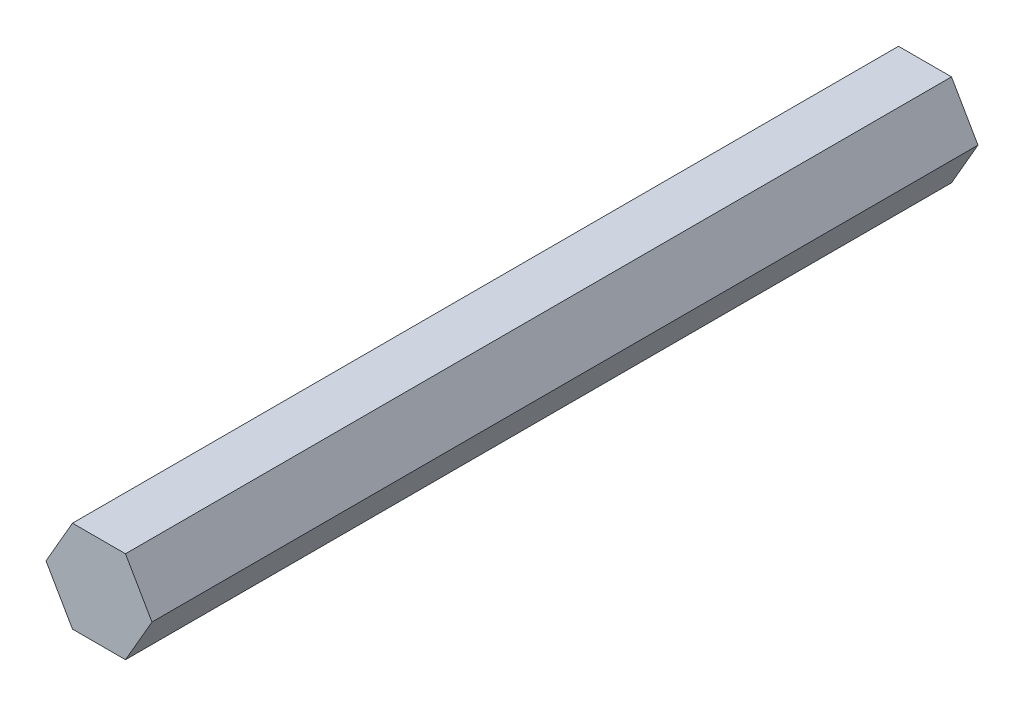
ISO-10303-21;
HEADER;
FILE_DESCRIPTION(('STEP AP214'),'2;1');
FILE_NAME('part.step','',(''),(''),'','','');
FILE_SCHEMA(('AUTOMOTIVE_DESIGN { 1 0 10303 214 1 1 1 1 }'));
ENDSEC;
DATA;
#1=APPLICATION_CONTEXT('core data for automotive mechanical design processes');
#2=APPLICATION_PROTOCOL_DEFINITION('international standard','automotive_design',2000,#1);
#3=PRODUCT_CONTEXT('',#1,'mechanical');
#4=PRODUCT('Part','Part','',(#3));
#5=PRODUCT_RELATED_PRODUCT_CATEGORY('part','',(#4));
#6=PRODUCT_DEFINITION_FORMATION('','',#4);
#7=PRODUCT_DEFINITION_CONTEXT('part definition',#1,'design');
#8=PRODUCT_DEFINITION('design','',#6,#7);
#9=PRODUCT_DEFINITION_SHAPE('','',#8);
#10=(LENGTH_UNIT() NAMED_UNIT(*) SI_UNIT(.MILLI.,.METRE.));
#11=(NAMED_UNIT(*) PLANE_ANGLE_UNIT() SI_UNIT($,.RADIAN.));
#12=(NAMED_UNIT(*) SI_UNIT($,.STERADIAN.) SOLID_ANGLE_UNIT());
#13=UNCERTAINTY_MEASURE_WITH_UNIT(LENGTH_MEASURE(1.E-05),#10,'distance_accuracy_value','');
#14=(GEOMETRIC_REPRESENTATION_CONTEXT(3) GLOBAL_UNCERTAINTY_ASSIGNED_CONTEXT((#13)) GLOBAL_UNIT_ASSIGNED_CONTEXT((#10,
#11,#12)) REPRESENTATION_CONTEXT('',''));
#15=CARTESIAN_POINT('',(0.,0.,0.));
#16=DIRECTION('',(0.,0.,1.));
#17=DIRECTION('',(1.,0.,0.));
#18=AXIS2_PLACEMENT_3D('',#15,#16,#17);
#19=CARTESIAN_POINT('',(-3.66617420935412,-6.35,57.15));
#20=DIRECTION('',(0.,1.,0.));
#21=DIRECTION('',(0.,0.,1.));
#22=AXIS2_PLACEMENT_3D('',#19,#20,#21);
#23=PLANE('',#22);
#24=DIRECTION('',(1.,0.,0.));
#25=VECTOR('',#24,1.);
#26=CARTESIAN_POINT('',(-3.66617420935412,-6.35,-57.15));
#27=LINE('',#26,#25);
#28=CARTESIAN_POINT('',(-3.66617420935412,-6.35,-57.15));
#29=VERTEX_POINT('',#28);
#30=CARTESIAN_POINT('',(3.66617420935412,-6.35,-57.15));
#31=VERTEX_POINT('',#30);
#32=EDGE_CURVE('E119',#29,#31,#27,.T.);
#33=ORIENTED_EDGE('',*,*,#32,.T.);
#34=DIRECTION('',(0.,0.,-1.));
#35=VECTOR('',#34,1.);
#36=CARTESIAN_POINT('',(3.66617420935412,-6.35,57.15));
#37=LINE('',#36,#35);
#38=CARTESIAN_POINT('',(3.66617420935412,-6.35,57.15));
#39=VERTEX_POINT('',#38);
#40=EDGE_CURVE('E11',#39,#31,#37,.T.);
#41=ORIENTED_EDGE('',*,*,#40,.F.);
#42=DIRECTION('',(1.,0.,0.));
#43=VECTOR('',#42,1.);
#44=CARTESIAN_POINT('',(-3.66617420935412,-6.35,57.15));
#45=LINE('',#44,#43);
#46=CARTESIAN_POINT('',(-3.66617420935412,-6.35,57.15));
#47=VERTEX_POINT('',#46);
#48=EDGE_CURVE('E129',#47,#39,#45,.T.);
#49=ORIENTED_EDGE('',*,*,#48,.F.);
#50=DIRECTION('',(0.,0.,-1.));
#51=VECTOR('',#50,1.);
#52=CARTESIAN_POINT('',(-3.66617420935412,-6.35,57.15));
#53=LINE('',#52,#51);
#54=EDGE_CURVE('E115',#47,#29,#53,.T.);
#55=ORIENTED_EDGE('',*,*,#54,.T.);
#56=EDGE_LOOP('',(#33,#41,#49,#55));
#57=FACE_BOUND('',#56,.T.);
#58=ADVANCED_FACE('F35',(#57),#23,.F.);
#59=CARTESIAN_POINT('',(3.66617420935412,-6.35,57.15));
#60=DIRECTION('',(-0.866025403784439,0.5,0.));
#61=DIRECTION('',(-0.5,-0.866025403784439,0.));
#62=AXIS2_PLACEMENT_3D('',#59,#60,#61);
#63=PLANE('',#62);
#64=DIRECTION('',(0.5,0.866025403784439,0.));
#65=VECTOR('',#64,1.);
#66=CARTESIAN_POINT('',(3.66617420935412,-6.35,-57.15));
#67=LINE('',#66,#65);
#68=CARTESIAN_POINT('',(7.33234841870824,0.,-57.15));
#69=VERTEX_POINT('',#68);
#70=EDGE_CURVE('E122',#31,#69,#67,.T.);
#71=ORIENTED_EDGE('',*,*,#70,.T.);
#72=DIRECTION('',(0.,0.,-1.));
#73=VECTOR('',#72,1.);
#74=CARTESIAN_POINT('',(7.33234841870824,0.,57.15));
#75=LINE('',#74,#73);
#76=CARTESIAN_POINT('',(7.33234841870824,0.,57.15));
#77=VERTEX_POINT('',#76);
#78=EDGE_CURVE('E43',#77,#69,#75,.T.);
#79=ORIENTED_EDGE('',*,*,#78,.F.);
#80=DIRECTION('',(0.5,0.866025403784439,0.));
#81=VECTOR('',#80,1.);
#82=CARTESIAN_POINT('',(3.66617420935412,-6.35,57.15));
#83=LINE('',#82,#81);
#84=EDGE_CURVE('E88',#39,#77,#83,.T.);
#85=ORIENTED_EDGE('',*,*,#84,.F.);
#86=ORIENTED_EDGE('',*,*,#40,.T.);
#87=EDGE_LOOP('',(#71,#79,#85,#86));
#88=FACE_BOUND('',#87,.T.);
#89=ADVANCED_FACE('F153',(#88),#63,.F.);
#90=CARTESIAN_POINT('',(7.33234841870824,0.,57.15));
#91=DIRECTION('',(-0.866025403784439,-0.5,0.));
#92=DIRECTION('',(0.5,-0.866025403784439,0.));
#93=AXIS2_PLACEMENT_3D('',#90,#91,#92);
#94=PLANE('',#93);
#95=DIRECTION('',(-0.5,0.866025403784438,0.));
#96=VECTOR('',#95,1.);
#97=CARTESIAN_POINT('',(7.33234841870824,0.,-57.15));
#98=LINE('',#97,#96);
#99=CARTESIAN_POINT('',(3.66617420935412,6.35,-57.15));
#100=VERTEX_POINT('',#99);
#101=EDGE_CURVE('E124',#69,#100,#98,.T.);
#102=ORIENTED_EDGE('',*,*,#101,.T.);
#103=DIRECTION('',(0.,0.,-1.));
#104=VECTOR('',#103,1.);
#105=CARTESIAN_POINT('',(3.66617420935412,6.35,57.15));
#106=LINE('',#105,#104);
#107=CARTESIAN_POINT('',(3.66617420935412,6.35,57.15));
#108=VERTEX_POINT('',#107);
#109=EDGE_CURVE('E110',#108,#100,#106,.T.);
#110=ORIENTED_EDGE('',*,*,#109,.F.);
#111=DIRECTION('',(-0.5,0.866025403784438,0.));
#112=VECTOR('',#111,1.);
#113=CARTESIAN_POINT('',(7.33234841870824,0.,57.15));
#114=LINE('',#113,#112);
#115=EDGE_CURVE('E101',#77,#108,#114,.T.);
#116=ORIENTED_EDGE('',*,*,#115,.F.);
#117=ORIENTED_EDGE('',*,*,#78,.T.);
#118=EDGE_LOOP('',(#102,#110,#116,#117));
#119=FACE_BOUND('',#118,.T.);
#120=ADVANCED_FACE('F135',(#119),#94,.F.);
#121=CARTESIAN_POINT('',(3.66617420935412,6.35,57.15));
#122=DIRECTION('',(0.,-1.,0.));
#123=DIRECTION('',(1.,0.,0.));
#124=AXIS2_PLACEMENT_3D('',#121,#122,#123);
#125=PLANE('',#124);
#126=DIRECTION('',(-1.,0.,0.));
#127=VECTOR('',#126,1.);
#128=CARTESIAN_POINT('',(3.66617420935412,6.35,-57.15));
#129=LINE('',#128,#127);
#130=CARTESIAN_POINT('',(-3.66617420935412,6.35,-57.15));
#131=VERTEX_POINT('',#130);
#132=EDGE_CURVE('E109',#100,#131,#129,.T.);
#133=ORIENTED_EDGE('',*,*,#132,.T.);
#134=DIRECTION('',(0.,0.,-1.));
#135=VECTOR('',#134,1.);
#136=CARTESIAN_POINT('',(-3.66617420935412,6.35,57.15));
#137=LINE('',#136,#135);
#138=CARTESIAN_POINT('',(-3.66617420935412,6.35,57.15));
#139=VERTEX_POINT('',#138);
#140=EDGE_CURVE('E106',#139,#131,#137,.T.);
#141=ORIENTED_EDGE('',*,*,#140,.F.);
#142=DIRECTION('',(-1.,0.,0.));
#143=VECTOR('',#142,1.);
#144=CARTESIAN_POINT('',(3.66617420935412,6.35,57.15));
#145=LINE('',#144,#143);
#146=EDGE_CURVE('E95',#108,#139,#145,.T.);
#147=ORIENTED_EDGE('',*,*,#146,.F.);
#148=ORIENTED_EDGE('',*,*,#109,.T.);
#149=EDGE_LOOP('',(#133,#141,#147,#148));
#150=FACE_BOUND('',#149,.T.);
#151=ADVANCED_FACE('F107',(#150),#125,.F.);
#152=CARTESIAN_POINT('',(-3.66617420935412,6.35,57.15));
#153=DIRECTION('',(0.866025403784439,-0.5,0.));
#154=DIRECTION('',(0.5,0.866025403784439,0.));
#155=AXIS2_PLACEMENT_3D('',#152,#153,#154);
#156=PLANE('',#155);
#157=DIRECTION('',(-0.5,-0.866025403784439,0.));
#158=VECTOR('',#157,1.);
#159=CARTESIAN_POINT('',(-3.66617420935412,6.35,-57.15));
#160=LINE('',#159,#158);
#161=CARTESIAN_POINT('',(-7.33234841870824,0.,-57.15));
#162=VERTEX_POINT('',#161);
#163=EDGE_CURVE('E74',#131,#162,#160,.T.);
#164=ORIENTED_EDGE('',*,*,#163,.T.);
#165=DIRECTION('',(0.,0.,-1.));
#166=VECTOR('',#165,1.);
#167=CARTESIAN_POINT('',(-7.33234841870824,0.,57.15));
#168=LINE('',#167,#166);
#169=CARTESIAN_POINT('',(-7.33234841870824,0.,57.15));
#170=VERTEX_POINT('',#169);
#171=EDGE_CURVE('E111',#170,#162,#168,.T.);
#172=ORIENTED_EDGE('',*,*,#171,.F.);
#173=DIRECTION('',(-0.5,-0.866025403784439,0.));
#174=VECTOR('',#173,1.);
#175=CARTESIAN_POINT('',(-3.66617420935412,6.35,57.15));
#176=LINE('',#175,#174);
#177=EDGE_CURVE('E99',#139,#170,#176,.T.);
#178=ORIENTED_EDGE('',*,*,#177,.F.);
#179=ORIENTED_EDGE('',*,*,#140,.T.);
#180=EDGE_LOOP('',(#164,#172,#178,#179));
#181=FACE_BOUND('',#180,.T.);
#182=ADVANCED_FACE('F113',(#181),#156,.F.);
#183=CARTESIAN_POINT('',(-7.33234841870824,0.,57.15));
#184=DIRECTION('',(0.866025403784439,0.5,0.));
#185=DIRECTION('',(-0.5,0.866025403784439,0.));
#186=AXIS2_PLACEMENT_3D('',#183,#184,#185);
#187=PLANE('',#186);
#188=DIRECTION('',(0.5,-0.866025403784438,0.));
#189=VECTOR('',#188,1.);
#190=CARTESIAN_POINT('',(-7.33234841870824,0.,-57.15));
#191=LINE('',#190,#189);
#192=EDGE_CURVE('E80',#162,#29,#191,.T.);
#193=ORIENTED_EDGE('',*,*,#192,.T.);
#194=ORIENTED_EDGE('',*,*,#54,.F.);
#195=DIRECTION('',(0.5,-0.866025403784438,0.));
#196=VECTOR('',#195,1.);
#197=CARTESIAN_POINT('',(-7.33234841870824,0.,57.15));
#198=LINE('',#197,#196);
#199=EDGE_CURVE('E51',#170,#47,#198,.T.);
#200=ORIENTED_EDGE('',*,*,#199,.F.);
#201=ORIENTED_EDGE('',*,*,#171,.T.);
#202=EDGE_LOOP('',(#193,#194,#200,#201));
#203=FACE_BOUND('',#202,.T.);
#204=ADVANCED_FACE('F142',(#203),#187,.F.);
#205=CARTESIAN_POINT('',(0.,0.,57.15));
#206=DIRECTION('',(0.,0.,1.));
#207=DIRECTION('',(1.,0.,0.));
#208=AXIS2_PLACEMENT_3D('',#205,#206,#207);
#209=PLANE('',#208);
#210=ORIENTED_EDGE('',*,*,#48,.T.);
#211=ORIENTED_EDGE('',*,*,#84,.T.);
#212=ORIENTED_EDGE('',*,*,#115,.T.);
#213=ORIENTED_EDGE('',*,*,#146,.T.);
#214=ORIENTED_EDGE('',*,*,#177,.T.);
#215=ORIENTED_EDGE('',*,*,#199,.T.);
#216=EDGE_LOOP('',(#210,#211,#212,#213,#214,#215));
#217=FACE_BOUND('',#216,.T.);
#218=ADVANCED_FACE('F97',(#217),#209,.T.);
#219=CARTESIAN_POINT('',(0.,0.,-57.15));
#220=DIRECTION('',(0.,0.,1.));
#221=DIRECTION('',(1.,0.,0.));
#222=AXIS2_PLACEMENT_3D('',#219,#220,#221);
#223=PLANE('',#222);
#224=ORIENTED_EDGE('',*,*,#32,.F.);
#225=ORIENTED_EDGE('',*,*,#192,.F.);
#226=ORIENTED_EDGE('',*,*,#163,.F.);
#227=ORIENTED_EDGE('',*,*,#132,.F.);
#228=ORIENTED_EDGE('',*,*,#101,.F.);
#229=ORIENTED_EDGE('',*,*,#70,.F.);
#230=EDGE_LOOP('',(#224,#225,#226,#227,#228,#229));
#231=FACE_BOUND('',#230,.T.);
#232=ADVANCED_FACE('F138',(#231),#223,.F.);
#233=CLOSED_SHELL('',(#58,#89,#120,#151,#182,#204,#218,#232));
#234=MANIFOLD_SOLID_BREP('B2',#233);
#235=ADVANCED_BREP_SHAPE_REPRESENTATION('',(#18,#234),#14);
#236=SHAPE_DEFINITION_REPRESENTATION(#9,#235);
ENDSEC;
END-ISO-10303-21;
